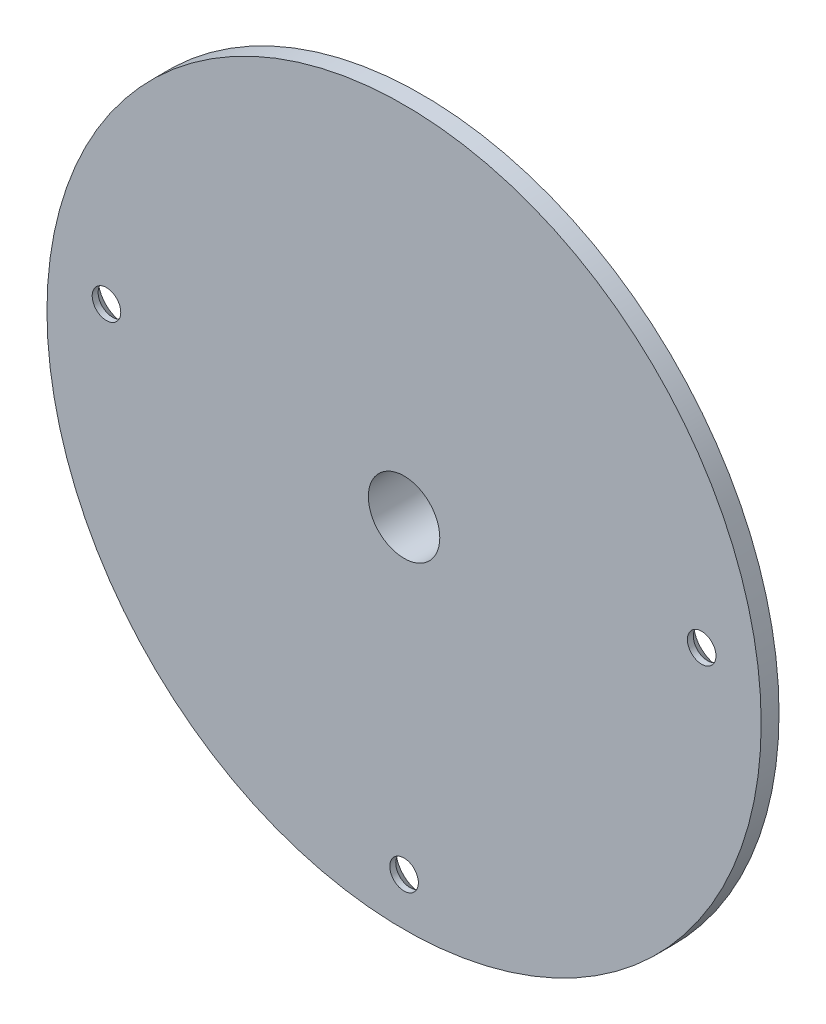
ISO-10303-21;
HEADER;
FILE_DESCRIPTION(('STEP AP214'),'2;1');
FILE_NAME('part.step','',(''),(''),'','','');
FILE_SCHEMA(('AUTOMOTIVE_DESIGN { 1 0 10303 214 1 1 1 1 }'));
ENDSEC;
DATA;
#1=APPLICATION_CONTEXT('core data for automotive mechanical design processes');
#2=APPLICATION_PROTOCOL_DEFINITION('international standard','automotive_design',2000,#1);
#3=PRODUCT_CONTEXT('',#1,'mechanical');
#4=PRODUCT('Part','Part','',(#3));
#5=PRODUCT_RELATED_PRODUCT_CATEGORY('part','',(#4));
#6=PRODUCT_DEFINITION_FORMATION('','',#4);
#7=PRODUCT_DEFINITION_CONTEXT('part definition',#1,'design');
#8=PRODUCT_DEFINITION('design','',#6,#7);
#9=PRODUCT_DEFINITION_SHAPE('','',#8);
#10=(LENGTH_UNIT() NAMED_UNIT(*) SI_UNIT(.MILLI.,.METRE.));
#11=(NAMED_UNIT(*) PLANE_ANGLE_UNIT() SI_UNIT($,.RADIAN.));
#12=(NAMED_UNIT(*) SI_UNIT($,.STERADIAN.) SOLID_ANGLE_UNIT());
#13=UNCERTAINTY_MEASURE_WITH_UNIT(LENGTH_MEASURE(1.E-05),#10,'distance_accuracy_value','');
#14=(GEOMETRIC_REPRESENTATION_CONTEXT(3) GLOBAL_UNCERTAINTY_ASSIGNED_CONTEXT((#13)) GLOBAL_UNIT_ASSIGNED_CONTEXT((#10,
#11,#12)) REPRESENTATION_CONTEXT('',''));
#15=CARTESIAN_POINT('',(0.,0.,0.));
#16=DIRECTION('',(0.,0.,1.));
#17=DIRECTION('',(1.,0.,0.));
#18=AXIS2_PLACEMENT_3D('',#15,#16,#17);
#19=CARTESIAN_POINT('',(0.,0.,0.));
#20=DIRECTION('',(0.,0.,1.));
#21=DIRECTION('',(1.,0.,0.));
#22=AXIS2_PLACEMENT_3D('',#19,#20,#21);
#23=PLANE('',#22);
#24=CARTESIAN_POINT('',(0.,0.,0.));
#25=DIRECTION('',(0.,0.,1.));
#26=DIRECTION('',(1.,0.,0.));
#27=AXIS2_PLACEMENT_3D('',#24,#25,#26);
#28=CIRCLE('',#27,4.5);
#29=CARTESIAN_POINT('',(4.5,0.,0.));
#30=VERTEX_POINT('',#29);
#31=EDGE_CURVE('E10',#30,#30,#28,.F.);
#32=ORIENTED_EDGE('',*,*,#31,.F.);
#33=EDGE_LOOP('',(#32));
#34=FACE_BOUND('',#33,.T.);
#35=CARTESIAN_POINT('',(0.,-26.,0.));
#36=DIRECTION('',(0.,0.,-1.));
#37=DIRECTION('',(-1.,0.,0.));
#38=AXIS2_PLACEMENT_3D('',#35,#36,#37);
#39=CIRCLE('',#38,2.2);
#40=CARTESIAN_POINT('',(-2.20000000000001,-26.,0.));
#41=VERTEX_POINT('',#40);
#42=EDGE_CURVE('E83',#41,#41,#39,.T.);
#43=ORIENTED_EDGE('',*,*,#42,.F.);
#44=EDGE_LOOP('',(#43));
#45=FACE_BOUND('',#44,.T.);
#46=CARTESIAN_POINT('',(25.,3.,0.));
#47=DIRECTION('',(0.,0.,-1.));
#48=DIRECTION('',(-1.,0.,0.));
#49=AXIS2_PLACEMENT_3D('',#46,#47,#48);
#50=CIRCLE('',#49,2.2);
#51=CARTESIAN_POINT('',(22.8,3.,0.));
#52=VERTEX_POINT('',#51);
#53=EDGE_CURVE('E74',#52,#52,#50,.T.);
#54=ORIENTED_EDGE('',*,*,#53,.F.);
#55=EDGE_LOOP('',(#54));
#56=FACE_BOUND('',#55,.T.);
#57=CARTESIAN_POINT('',(0.,0.,0.));
#58=DIRECTION('',(0.,0.,1.));
#59=DIRECTION('',(1.,0.,0.));
#60=AXIS2_PLACEMENT_3D('',#57,#58,#59);
#61=CIRCLE('',#60,30.);
#62=CARTESIAN_POINT('',(30.,0.,0.));
#63=VERTEX_POINT('',#62);
#64=EDGE_CURVE('E50',#63,#63,#61,.T.);
#65=ORIENTED_EDGE('',*,*,#64,.F.);
#66=EDGE_LOOP('',(#65));
#67=FACE_BOUND('',#66,.T.);
#68=CARTESIAN_POINT('',(-25.,3.00000000000001,0.));
#69=DIRECTION('',(0.,0.,-1.));
#70=DIRECTION('',(-1.,0.,0.));
#71=AXIS2_PLACEMENT_3D('',#68,#69,#70);
#72=CIRCLE('',#71,2.2);
#73=CARTESIAN_POINT('',(-27.2,3.00000000000001,0.));
#74=VERTEX_POINT('',#73);
#75=EDGE_CURVE('E69',#74,#74,#72,.T.);
#76=ORIENTED_EDGE('',*,*,#75,.F.);
#77=EDGE_LOOP('',(#76));
#78=FACE_BOUND('',#77,.T.);
#79=ADVANCED_FACE('F37',(#34,#45,#56,#67,#78),#23,.F.);
#80=CARTESIAN_POINT('',(0.,0.,1.5));
#81=DIRECTION('',(0.,0.,1.));
#82=DIRECTION('',(1.,0.,0.));
#83=AXIS2_PLACEMENT_3D('',#80,#81,#82);
#84=PLANE('',#83);
#85=CARTESIAN_POINT('',(0.,-26.,1.5));
#86=DIRECTION('',(0.,0.,1.));
#87=DIRECTION('',(1.,0.,0.));
#88=AXIS2_PLACEMENT_3D('',#85,#86,#87);
#89=CIRCLE('',#88,1.19999999999999);
#90=CARTESIAN_POINT('',(1.19999999999998,-26.,1.5));
#91=VERTEX_POINT('',#90);
#92=EDGE_CURVE('E71',#91,#91,#89,.T.);
#93=ORIENTED_EDGE('',*,*,#92,.F.);
#94=EDGE_LOOP('',(#93));
#95=FACE_BOUND('',#94,.T.);
#96=CARTESIAN_POINT('',(25.,3.,1.5));
#97=DIRECTION('',(0.,0.,1.));
#98=DIRECTION('',(1.,0.,0.));
#99=AXIS2_PLACEMENT_3D('',#96,#97,#98);
#100=CIRCLE('',#99,1.19999999999999);
#101=CARTESIAN_POINT('',(26.2,3.,1.5));
#102=VERTEX_POINT('',#101);
#103=EDGE_CURVE('E66',#102,#102,#100,.T.);
#104=ORIENTED_EDGE('',*,*,#103,.F.);
#105=EDGE_LOOP('',(#104));
#106=FACE_BOUND('',#105,.T.);
#107=CARTESIAN_POINT('',(-25.,3.00000000000001,1.5));
#108=DIRECTION('',(0.,0.,1.));
#109=DIRECTION('',(1.,0.,0.));
#110=AXIS2_PLACEMENT_3D('',#107,#108,#109);
#111=CIRCLE('',#110,1.19999999999999);
#112=CARTESIAN_POINT('',(-23.8,3.00000000000001,1.5));
#113=VERTEX_POINT('',#112);
#114=EDGE_CURVE('E61',#113,#113,#111,.T.);
#115=ORIENTED_EDGE('',*,*,#114,.F.);
#116=EDGE_LOOP('',(#115));
#117=FACE_BOUND('',#116,.T.);
#118=CARTESIAN_POINT('',(0.,0.,1.5));
#119=DIRECTION('',(0.,0.,1.));
#120=DIRECTION('',(1.,0.,0.));
#121=AXIS2_PLACEMENT_3D('',#118,#119,#120);
#122=CIRCLE('',#121,30.);
#123=CARTESIAN_POINT('',(30.,0.,1.5));
#124=VERTEX_POINT('',#123);
#125=EDGE_CURVE('E45',#124,#124,#122,.T.);
#126=ORIENTED_EDGE('',*,*,#125,.T.);
#127=EDGE_LOOP('',(#126));
#128=FACE_BOUND('',#127,.T.);
#129=CARTESIAN_POINT('',(0.,0.,1.5));
#130=DIRECTION('',(0.,0.,1.));
#131=DIRECTION('',(1.,0.,0.));
#132=AXIS2_PLACEMENT_3D('',#129,#130,#131);
#133=CIRCLE('',#132,3.);
#134=CARTESIAN_POINT('',(3.,0.,1.5));
#135=VERTEX_POINT('',#134);
#136=EDGE_CURVE('E56',#135,#135,#133,.T.);
#137=ORIENTED_EDGE('',*,*,#136,.F.);
#138=EDGE_LOOP('',(#137));
#139=FACE_BOUND('',#138,.T.);
#140=ADVANCED_FACE('F112',(#95,#106,#117,#128,#139),#84,.T.);
#141=CARTESIAN_POINT('',(0.,0.,1.5));
#142=DIRECTION('',(0.,0.,-1.));
#143=DIRECTION('',(-1.,0.,0.));
#144=AXIS2_PLACEMENT_3D('',#141,#142,#143);
#145=CYLINDRICAL_SURFACE('',#144,30.);
#146=ORIENTED_EDGE('',*,*,#125,.F.);
#147=EDGE_LOOP('',(#146));
#148=FACE_BOUND('',#147,.T.);
#149=ORIENTED_EDGE('',*,*,#64,.T.);
#150=EDGE_LOOP('',(#149));
#151=FACE_BOUND('',#150,.T.);
#152=ADVANCED_FACE('F39',(#148,#151),#145,.T.);
#153=CARTESIAN_POINT('',(0.,0.,1.5));
#154=DIRECTION('',(0.,0.,-1.));
#155=DIRECTION('',(-1.,0.,0.));
#156=AXIS2_PLACEMENT_3D('',#153,#154,#155);
#157=CYLINDRICAL_SURFACE('',#156,3.);
#158=ORIENTED_EDGE('',*,*,#136,.T.);
#159=EDGE_LOOP('',(#158));
#160=FACE_BOUND('',#159,.T.);
#161=CARTESIAN_POINT('',(0.,0.,-4.));
#162=DIRECTION('',(0.,0.,-1.));
#163=DIRECTION('',(-1.,0.,0.));
#164=AXIS2_PLACEMENT_3D('',#161,#162,#163);
#165=CIRCLE('',#164,3.);
#166=CARTESIAN_POINT('',(-3.,0.,-4.));
#167=VERTEX_POINT('',#166);
#168=EDGE_CURVE('E154',#167,#167,#165,.T.);
#169=ORIENTED_EDGE('',*,*,#168,.T.);
#170=EDGE_LOOP('',(#169));
#171=FACE_BOUND('',#170,.T.);
#172=ADVANCED_FACE('F121',(#160,#171),#157,.F.);
#173=CARTESIAN_POINT('',(-25.,3.00000000000001,0.));
#174=DIRECTION('',(0.,0.,-1.));
#175=DIRECTION('',(-1.,0.,0.));
#176=AXIS2_PLACEMENT_3D('',#173,#174,#175);
#177=CYLINDRICAL_SURFACE('',#176,1.19999999999999);
#178=ORIENTED_EDGE('',*,*,#114,.T.);
#179=EDGE_LOOP('',(#178));
#180=FACE_BOUND('',#179,.T.);
#181=CARTESIAN_POINT('',(-25.,3.00000000000001,1.));
#182=DIRECTION('',(0.,0.,-1.));
#183=DIRECTION('',(-1.,0.,0.));
#184=AXIS2_PLACEMENT_3D('',#181,#182,#183);
#185=CIRCLE('',#184,1.19999999999999);
#186=CARTESIAN_POINT('',(-26.2,3.00000000000001,1.));
#187=VERTEX_POINT('',#186);
#188=EDGE_CURVE('E65',#187,#187,#185,.T.);
#189=ORIENTED_EDGE('',*,*,#188,.T.);
#190=EDGE_LOOP('',(#189));
#191=FACE_BOUND('',#190,.T.);
#192=ADVANCED_FACE('F102',(#180,#191),#177,.F.);
#193=CARTESIAN_POINT('',(-25.,3.00000000000001,0.));
#194=DIRECTION('',(0.,0.,-1.));
#195=DIRECTION('',(-1.,0.,0.));
#196=AXIS2_PLACEMENT_3D('',#193,#194,#195);
#197=CONICAL_SURFACE('',#196,2.2,0.785398163397453);
#198=ORIENTED_EDGE('',*,*,#188,.F.);
#199=EDGE_LOOP('',(#198));
#200=FACE_BOUND('',#199,.T.);
#201=ORIENTED_EDGE('',*,*,#75,.T.);
#202=EDGE_LOOP('',(#201));
#203=FACE_BOUND('',#202,.T.);
#204=ADVANCED_FACE('F104',(#200,#203),#197,.F.);
#205=CARTESIAN_POINT('',(25.,3.,0.));
#206=DIRECTION('',(0.,0.,-1.));
#207=DIRECTION('',(-1.,0.,0.));
#208=AXIS2_PLACEMENT_3D('',#205,#206,#207);
#209=CYLINDRICAL_SURFACE('',#208,1.19999999999999);
#210=ORIENTED_EDGE('',*,*,#103,.T.);
#211=EDGE_LOOP('',(#210));
#212=FACE_BOUND('',#211,.T.);
#213=CARTESIAN_POINT('',(25.,3.,1.));
#214=DIRECTION('',(0.,0.,-1.));
#215=DIRECTION('',(-1.,0.,0.));
#216=AXIS2_PLACEMENT_3D('',#213,#214,#215);
#217=CIRCLE('',#216,1.19999999999999);
#218=CARTESIAN_POINT('',(23.8,3.,1.));
#219=VERTEX_POINT('',#218);
#220=EDGE_CURVE('E70',#219,#219,#217,.T.);
#221=ORIENTED_EDGE('',*,*,#220,.T.);
#222=EDGE_LOOP('',(#221));
#223=FACE_BOUND('',#222,.T.);
#224=ADVANCED_FACE('F107',(#212,#223),#209,.F.);
#225=CARTESIAN_POINT('',(25.,3.,0.));
#226=DIRECTION('',(0.,0.,-1.));
#227=DIRECTION('',(-1.,0.,0.));
#228=AXIS2_PLACEMENT_3D('',#225,#226,#227);
#229=CONICAL_SURFACE('',#228,2.2,0.785398163397453);
#230=ORIENTED_EDGE('',*,*,#220,.F.);
#231=EDGE_LOOP('',(#230));
#232=FACE_BOUND('',#231,.T.);
#233=ORIENTED_EDGE('',*,*,#53,.T.);
#234=EDGE_LOOP('',(#233));
#235=FACE_BOUND('',#234,.T.);
#236=ADVANCED_FACE('F130',(#232,#235),#229,.F.);
#237=CARTESIAN_POINT('',(0.,-26.,0.));
#238=DIRECTION('',(0.,0.,-1.));
#239=DIRECTION('',(-1.,0.,0.));
#240=AXIS2_PLACEMENT_3D('',#237,#238,#239);
#241=CYLINDRICAL_SURFACE('',#240,1.19999999999999);
#242=ORIENTED_EDGE('',*,*,#92,.T.);
#243=EDGE_LOOP('',(#242));
#244=FACE_BOUND('',#243,.T.);
#245=CARTESIAN_POINT('',(0.,-26.,1.));
#246=DIRECTION('',(0.,0.,-1.));
#247=DIRECTION('',(-1.,0.,0.));
#248=AXIS2_PLACEMENT_3D('',#245,#246,#247);
#249=CIRCLE('',#248,1.19999999999999);
#250=CARTESIAN_POINT('',(-1.2,-26.,1.));
#251=VERTEX_POINT('',#250);
#252=EDGE_CURVE('E75',#251,#251,#249,.T.);
#253=ORIENTED_EDGE('',*,*,#252,.T.);
#254=EDGE_LOOP('',(#253));
#255=FACE_BOUND('',#254,.T.);
#256=ADVANCED_FACE('F134',(#244,#255),#241,.F.);
#257=CARTESIAN_POINT('',(0.,-26.,0.));
#258=DIRECTION('',(0.,0.,-1.));
#259=DIRECTION('',(-1.,0.,0.));
#260=AXIS2_PLACEMENT_3D('',#257,#258,#259);
#261=CONICAL_SURFACE('',#260,2.2,0.785398163397453);
#262=ORIENTED_EDGE('',*,*,#252,.F.);
#263=EDGE_LOOP('',(#262));
#264=FACE_BOUND('',#263,.T.);
#265=ORIENTED_EDGE('',*,*,#42,.T.);
#266=EDGE_LOOP('',(#265));
#267=FACE_BOUND('',#266,.T.);
#268=ADVANCED_FACE('F138',(#264,#267),#261,.F.);
#269=CARTESIAN_POINT('',(0.,0.,-4.));
#270=DIRECTION('',(0.,0.,1.));
#271=DIRECTION('',(1.,0.,0.));
#272=AXIS2_PLACEMENT_3D('',#269,#270,#271);
#273=CYLINDRICAL_SURFACE('',#272,4.5);
#274=CARTESIAN_POINT('',(0.,0.,-4.));
#275=DIRECTION('',(0.,0.,-1.));
#276=DIRECTION('',(-1.,0.,0.));
#277=AXIS2_PLACEMENT_3D('',#274,#275,#276);
#278=CIRCLE('',#277,4.5);
#279=CARTESIAN_POINT('',(-4.5,0.,-4.));
#280=VERTEX_POINT('',#279);
#281=EDGE_CURVE('E89',#280,#280,#278,.T.);
#282=ORIENTED_EDGE('',*,*,#281,.F.);
#283=EDGE_LOOP('',(#282));
#284=FACE_BOUND('',#283,.T.);
#285=ORIENTED_EDGE('',*,*,#31,.T.);
#286=EDGE_LOOP('',(#285));
#287=FACE_BOUND('',#286,.T.);
#288=ADVANCED_FACE('F141',(#284,#287),#273,.T.);
#289=CARTESIAN_POINT('',(0.,0.,-4.));
#290=DIRECTION('',(0.,0.,-1.));
#291=DIRECTION('',(-1.,0.,0.));
#292=AXIS2_PLACEMENT_3D('',#289,#290,#291);
#293=PLANE('',#292);
#294=ORIENTED_EDGE('',*,*,#168,.F.);
#295=EDGE_LOOP('',(#294));
#296=FACE_BOUND('',#295,.T.);
#297=ORIENTED_EDGE('',*,*,#281,.T.);
#298=EDGE_LOOP('',(#297));
#299=FACE_BOUND('',#298,.T.);
#300=ADVANCED_FACE('F145',(#296,#299),#293,.T.);
#301=CLOSED_SHELL('',(#79,#140,#152,#172,#192,#204,#224,#236,#256,#268,#288,#300));
#302=MANIFOLD_SOLID_BREP('B2',#301);
#303=ADVANCED_BREP_SHAPE_REPRESENTATION('',(#18,#302),#14);
#304=SHAPE_DEFINITION_REPRESENTATION(#9,#303);
ENDSEC;
END-ISO-10303-21;
